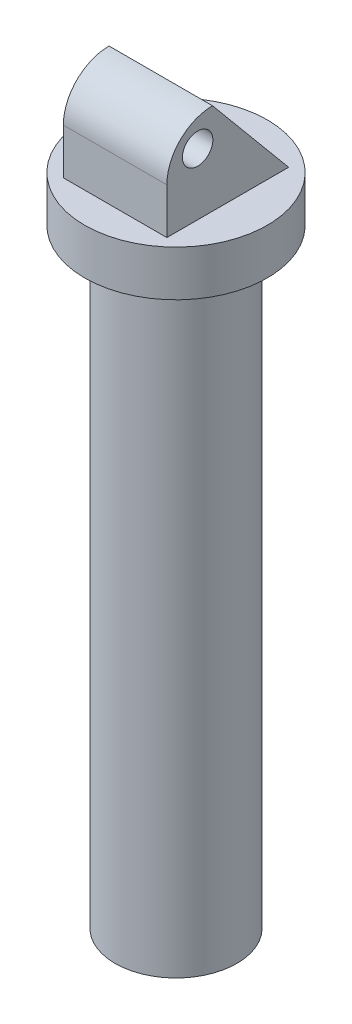
ISO-10303-21;
HEADER;
FILE_DESCRIPTION(('STEP AP214'),'2;1');
FILE_NAME('part.step','',(''),(''),'','','');
FILE_SCHEMA(('AUTOMOTIVE_DESIGN { 1 0 10303 214 1 1 1 1 }'));
ENDSEC;
DATA;
#1=APPLICATION_CONTEXT('core data for automotive mechanical design processes');
#2=APPLICATION_PROTOCOL_DEFINITION('international standard','automotive_design',2000,#1);
#3=PRODUCT_CONTEXT('',#1,'mechanical');
#4=PRODUCT('Part','Part','',(#3));
#5=PRODUCT_RELATED_PRODUCT_CATEGORY('part','',(#4));
#6=PRODUCT_DEFINITION_FORMATION('','',#4);
#7=PRODUCT_DEFINITION_CONTEXT('part definition',#1,'design');
#8=PRODUCT_DEFINITION('design','',#6,#7);
#9=PRODUCT_DEFINITION_SHAPE('','',#8);
#10=(LENGTH_UNIT() NAMED_UNIT(*) SI_UNIT(.MILLI.,.METRE.));
#11=(NAMED_UNIT(*) PLANE_ANGLE_UNIT() SI_UNIT($,.RADIAN.));
#12=(NAMED_UNIT(*) SI_UNIT($,.STERADIAN.) SOLID_ANGLE_UNIT());
#13=UNCERTAINTY_MEASURE_WITH_UNIT(LENGTH_MEASURE(1.E-05),#10,'distance_accuracy_value','');
#14=(GEOMETRIC_REPRESENTATION_CONTEXT(3) GLOBAL_UNCERTAINTY_ASSIGNED_CONTEXT((#13)) GLOBAL_UNIT_ASSIGNED_CONTEXT((#10,
#11,#12)) REPRESENTATION_CONTEXT('',''));
#15=CARTESIAN_POINT('',(0.,0.,0.));
#16=DIRECTION('',(0.,0.,1.));
#17=DIRECTION('',(1.,0.,0.));
#18=AXIS2_PLACEMENT_3D('',#15,#16,#17);
#19=CARTESIAN_POINT('',(0.,200.,0.));
#20=DIRECTION('',(0.,-1.,0.));
#21=DIRECTION('',(0.,0.,-1.));
#22=AXIS2_PLACEMENT_3D('',#19,#20,#21);
#23=CYLINDRICAL_SURFACE('',#22,20.);
#24=CARTESIAN_POINT('',(0.,200.,0.));
#25=DIRECTION('',(0.,1.,0.));
#26=DIRECTION('',(0.,0.,1.));
#27=AXIS2_PLACEMENT_3D('',#24,#25,#26);
#28=CIRCLE('',#27,20.);
#29=CARTESIAN_POINT('',(0.,200.,20.));
#30=VERTEX_POINT('',#29);
#31=EDGE_CURVE('E98',#30,#30,#28,.T.);
#32=ORIENTED_EDGE('',*,*,#31,.F.);
#33=EDGE_LOOP('',(#32));
#34=FACE_BOUND('',#33,.T.);
#35=CARTESIAN_POINT('',(0.,0.,0.));
#36=DIRECTION('',(0.,1.,0.));
#37=DIRECTION('',(0.,0.,1.));
#38=AXIS2_PLACEMENT_3D('',#35,#36,#37);
#39=CIRCLE('',#38,20.);
#40=CARTESIAN_POINT('',(0.,0.,20.));
#41=VERTEX_POINT('',#40);
#42=EDGE_CURVE('E137',#41,#41,#39,.T.);
#43=ORIENTED_EDGE('',*,*,#42,.T.);
#44=EDGE_LOOP('',(#43));
#45=FACE_BOUND('',#44,.T.);
#46=ADVANCED_FACE('F45',(#34,#45),#23,.T.);
#47=CARTESIAN_POINT('',(0.,0.,0.));
#48=DIRECTION('',(0.,1.,0.));
#49=DIRECTION('',(0.,0.,1.));
#50=AXIS2_PLACEMENT_3D('',#47,#48,#49);
#51=PLANE('',#50);
#52=ORIENTED_EDGE('',*,*,#42,.F.);
#53=EDGE_LOOP('',(#52));
#54=FACE_BOUND('',#53,.T.);
#55=ADVANCED_FACE('F151',(#54),#51,.F.);
#56=CARTESIAN_POINT('',(0.,215.,0.));
#57=DIRECTION('',(0.,-1.,0.));
#58=DIRECTION('',(0.,0.,-1.));
#59=AXIS2_PLACEMENT_3D('',#56,#57,#58);
#60=CYLINDRICAL_SURFACE('',#59,30.);
#61=CARTESIAN_POINT('',(0.,215.,0.));
#62=DIRECTION('',(0.,1.,0.));
#63=DIRECTION('',(0.,0.,1.));
#64=AXIS2_PLACEMENT_3D('',#61,#62,#63);
#65=CIRCLE('',#64,30.);
#66=CARTESIAN_POINT('',(0.,215.,30.));
#67=VERTEX_POINT('',#66);
#68=EDGE_CURVE('E133',#67,#67,#65,.T.);
#69=ORIENTED_EDGE('',*,*,#68,.F.);
#70=EDGE_LOOP('',(#69));
#71=FACE_BOUND('',#70,.T.);
#72=CARTESIAN_POINT('',(0.,200.,0.));
#73=DIRECTION('',(0.,1.,0.));
#74=DIRECTION('',(0.,0.,1.));
#75=AXIS2_PLACEMENT_3D('',#72,#73,#74);
#76=CIRCLE('',#75,30.);
#77=CARTESIAN_POINT('',(0.,200.,30.));
#78=VERTEX_POINT('',#77);
#79=EDGE_CURVE('E132',#78,#78,#76,.T.);
#80=ORIENTED_EDGE('',*,*,#79,.T.);
#81=EDGE_LOOP('',(#80));
#82=FACE_BOUND('',#81,.T.);
#83=ADVANCED_FACE('F153',(#71,#82),#60,.T.);
#84=CARTESIAN_POINT('',(0.,215.,0.));
#85=DIRECTION('',(0.,1.,0.));
#86=DIRECTION('',(0.,0.,1.));
#87=AXIS2_PLACEMENT_3D('',#84,#85,#86);
#88=PLANE('',#87);
#89=DIRECTION('',(0.,0.,1.));
#90=VECTOR('',#89,1.);
#91=CARTESIAN_POINT('',(-17.,215.,20.));
#92=LINE('',#91,#90);
#93=CARTESIAN_POINT('',(-17.,215.,-20.));
#94=VERTEX_POINT('',#93);
#95=CARTESIAN_POINT('',(-17.,215.,20.));
#96=VERTEX_POINT('',#95);
#97=EDGE_CURVE('E118',#94,#96,#92,.T.);
#98=ORIENTED_EDGE('',*,*,#97,.F.);
#99=DIRECTION('',(-1.,0.,0.));
#100=VECTOR('',#99,1.);
#101=CARTESIAN_POINT('',(-17.,215.,-20.));
#102=LINE('',#101,#100);
#103=CARTESIAN_POINT('',(17.,215.,-20.));
#104=VERTEX_POINT('',#103);
#105=EDGE_CURVE('E115',#104,#94,#102,.T.);
#106=ORIENTED_EDGE('',*,*,#105,.F.);
#107=DIRECTION('',(0.,0.,-1.));
#108=VECTOR('',#107,1.);
#109=CARTESIAN_POINT('',(17.,215.,20.));
#110=LINE('',#109,#108);
#111=CARTESIAN_POINT('',(17.,215.,20.));
#112=VERTEX_POINT('',#111);
#113=EDGE_CURVE('E103',#112,#104,#110,.T.);
#114=ORIENTED_EDGE('',*,*,#113,.F.);
#115=DIRECTION('',(1.,0.,0.));
#116=VECTOR('',#115,1.);
#117=CARTESIAN_POINT('',(-17.,215.,20.));
#118=LINE('',#117,#116);
#119=EDGE_CURVE('E122',#96,#112,#118,.T.);
#120=ORIENTED_EDGE('',*,*,#119,.F.);
#121=EDGE_LOOP('',(#98,#106,#114,#120));
#122=FACE_BOUND('',#121,.T.);
#123=ORIENTED_EDGE('',*,*,#68,.T.);
#124=EDGE_LOOP('',(#123));
#125=FACE_BOUND('',#124,.T.);
#126=ADVANCED_FACE('F160',(#122,#125),#88,.T.);
#127=CARTESIAN_POINT('',(0.,200.,0.));
#128=DIRECTION('',(0.,1.,0.));
#129=DIRECTION('',(0.,0.,1.));
#130=AXIS2_PLACEMENT_3D('',#127,#128,#129);
#131=PLANE('',#130);
#132=ORIENTED_EDGE('',*,*,#31,.T.);
#133=EDGE_LOOP('',(#132));
#134=FACE_BOUND('',#133,.T.);
#135=ORIENTED_EDGE('',*,*,#79,.F.);
#136=EDGE_LOOP('',(#135));
#137=FACE_BOUND('',#136,.T.);
#138=ADVANCED_FACE('F165',(#134,#137),#131,.F.);
#139=CARTESIAN_POINT('',(17.,245.,20.));
#140=DIRECTION('',(-1.,0.,0.));
#141=DIRECTION('',(0.,0.,1.));
#142=AXIS2_PLACEMENT_3D('',#139,#140,#141);
#143=PLANE('',#142);
#144=CARTESIAN_POINT('',(17.,235.24975043011,9.89187481826981));
#145=DIRECTION('',(1.,0.,0.));
#146=DIRECTION('',(0.,0.,-1.));
#147=AXIS2_PLACEMENT_3D('',#144,#145,#146);
#148=CIRCLE('',#147,5.);
#149=CARTESIAN_POINT('',(17.,235.24975043011,4.89187481826981));
#150=VERTEX_POINT('',#149);
#151=EDGE_CURVE('E110',#150,#150,#148,.T.);
#152=ORIENTED_EDGE('',*,*,#151,.F.);
#153=EDGE_LOOP('',(#152));
#154=FACE_BOUND('',#153,.T.);
#155=DIRECTION('',(0.,-0.768221279597376,-0.64018439966448));
#156=VECTOR('',#155,1.);
#157=CARTESIAN_POINT('',(17.,215.,-20.));
#158=LINE('',#157,#156);
#159=CARTESIAN_POINT('',(17.,245.,5.));
#160=VERTEX_POINT('',#159);
#161=EDGE_CURVE('E93',#160,#104,#158,.T.);
#162=ORIENTED_EDGE('',*,*,#161,.F.);
#163=CARTESIAN_POINT('',(17.,230.,5.));
#164=DIRECTION('',(-1.,0.,0.));
#165=DIRECTION('',(0.,0.,1.));
#166=AXIS2_PLACEMENT_3D('',#163,#164,#165);
#167=CIRCLE('',#166,15.);
#168=CARTESIAN_POINT('',(17.,230.,20.));
#169=VERTEX_POINT('',#168);
#170=EDGE_CURVE('E69',#160,#169,#167,.F.);
#171=ORIENTED_EDGE('',*,*,#170,.T.);
#172=DIRECTION('',(0.,-1.,0.));
#173=VECTOR('',#172,1.);
#174=CARTESIAN_POINT('',(17.,245.,20.));
#175=LINE('',#174,#173);
#176=EDGE_CURVE('E126',#169,#112,#175,.T.);
#177=ORIENTED_EDGE('',*,*,#176,.T.);
#178=ORIENTED_EDGE('',*,*,#113,.T.);
#179=EDGE_LOOP('',(#162,#171,#177,#178));
#180=FACE_BOUND('',#179,.T.);
#181=ADVANCED_FACE('F101',(#154,#180),#143,.F.);
#182=CARTESIAN_POINT('',(-17.,245.,20.));
#183=DIRECTION('',(1.,0.,0.));
#184=DIRECTION('',(0.,0.,-1.));
#185=AXIS2_PLACEMENT_3D('',#182,#183,#184);
#186=PLANE('',#185);
#187=CARTESIAN_POINT('',(-17.,235.24975043011,9.89187481826981));
#188=DIRECTION('',(1.,0.,0.));
#189=DIRECTION('',(0.,0.,-1.));
#190=AXIS2_PLACEMENT_3D('',#187,#188,#189);
#191=CIRCLE('',#190,5.);
#192=CARTESIAN_POINT('',(-17.,235.24975043011,4.89187481826981));
#193=VERTEX_POINT('',#192);
#194=EDGE_CURVE('E49',#193,#193,#191,.T.);
#195=ORIENTED_EDGE('',*,*,#194,.T.);
#196=EDGE_LOOP('',(#195));
#197=FACE_BOUND('',#196,.T.);
#198=DIRECTION('',(0.,-1.,0.));
#199=VECTOR('',#198,1.);
#200=CARTESIAN_POINT('',(-17.,245.,20.));
#201=LINE('',#200,#199);
#202=CARTESIAN_POINT('',(-17.,230.,20.));
#203=VERTEX_POINT('',#202);
#204=EDGE_CURVE('E129',#203,#96,#201,.T.);
#205=ORIENTED_EDGE('',*,*,#204,.F.);
#206=CARTESIAN_POINT('',(-17.,230.,5.));
#207=DIRECTION('',(1.,0.,0.));
#208=DIRECTION('',(0.,0.,-1.));
#209=AXIS2_PLACEMENT_3D('',#206,#207,#208);
#210=CIRCLE('',#209,15.);
#211=CARTESIAN_POINT('',(-17.,245.,5.));
#212=VERTEX_POINT('',#211);
#213=EDGE_CURVE('E11',#203,#212,#210,.F.);
#214=ORIENTED_EDGE('',*,*,#213,.T.);
#215=DIRECTION('',(0.,-0.768221279597376,-0.64018439966448));
#216=VECTOR('',#215,1.);
#217=CARTESIAN_POINT('',(-17.,252.377049180328,11.1475409836066));
#218=LINE('',#217,#216);
#219=EDGE_CURVE('E96',#212,#94,#218,.T.);
#220=ORIENTED_EDGE('',*,*,#219,.T.);
#221=ORIENTED_EDGE('',*,*,#97,.T.);
#222=EDGE_LOOP('',(#205,#214,#220,#221));
#223=FACE_BOUND('',#222,.T.);
#224=ADVANCED_FACE('F173',(#197,#223),#186,.F.);
#225=CARTESIAN_POINT('',(-17.,245.,20.));
#226=DIRECTION('',(0.,0.,-1.));
#227=DIRECTION('',(-1.,0.,0.));
#228=AXIS2_PLACEMENT_3D('',#225,#226,#227);
#229=PLANE('',#228);
#230=ORIENTED_EDGE('',*,*,#176,.F.);
#231=DIRECTION('',(1.,0.,0.));
#232=VECTOR('',#231,1.);
#233=CARTESIAN_POINT('',(-17.,230.,20.));
#234=LINE('',#233,#232);
#235=EDGE_CURVE('E55',#169,#203,#234,.F.);
#236=ORIENTED_EDGE('',*,*,#235,.T.);
#237=ORIENTED_EDGE('',*,*,#204,.T.);
#238=ORIENTED_EDGE('',*,*,#119,.T.);
#239=EDGE_LOOP('',(#230,#236,#237,#238));
#240=FACE_BOUND('',#239,.T.);
#241=ADVANCED_FACE('F177',(#240),#229,.F.);
#242=CARTESIAN_POINT('',(-42.,215.,-20.));
#243=DIRECTION('',(0.,-0.64018439966448,0.768221279597376));
#244=DIRECTION('',(0.,-0.768221279597376,-0.64018439966448));
#245=AXIS2_PLACEMENT_3D('',#242,#243,#244);
#246=PLANE('',#245);
#247=DIRECTION('',(-1.,0.,0.));
#248=VECTOR('',#247,1.);
#249=CARTESIAN_POINT('',(0.,245.,5.));
#250=LINE('',#249,#248);
#251=EDGE_CURVE('E87',#160,#212,#250,.T.);
#252=ORIENTED_EDGE('',*,*,#251,.F.);
#253=ORIENTED_EDGE('',*,*,#161,.T.);
#254=ORIENTED_EDGE('',*,*,#105,.T.);
#255=ORIENTED_EDGE('',*,*,#219,.F.);
#256=EDGE_LOOP('',(#252,#253,#254,#255));
#257=FACE_BOUND('',#256,.T.);
#258=ADVANCED_FACE('F92',(#257),#246,.F.);
#259=CARTESIAN_POINT('',(0.,230.,5.));
#260=DIRECTION('',(1.,0.,0.));
#261=DIRECTION('',(0.,0.,-1.));
#262=AXIS2_PLACEMENT_3D('',#259,#260,#261);
#263=CYLINDRICAL_SURFACE('',#262,15.);
#264=ORIENTED_EDGE('',*,*,#213,.F.);
#265=ORIENTED_EDGE('',*,*,#235,.F.);
#266=ORIENTED_EDGE('',*,*,#170,.F.);
#267=ORIENTED_EDGE('',*,*,#251,.T.);
#268=EDGE_LOOP('',(#264,#265,#266,#267));
#269=FACE_BOUND('',#268,.T.);
#270=ADVANCED_FACE('F47',(#269),#263,.T.);
#271=CARTESIAN_POINT('',(-42.,235.24975043011,9.89187481826981));
#272=DIRECTION('',(1.,0.,0.));
#273=DIRECTION('',(0.,0.,-1.));
#274=AXIS2_PLACEMENT_3D('',#271,#272,#273);
#275=CYLINDRICAL_SURFACE('',#274,5.);
#276=CARTESIAN_POINT('',(17.,235.24975043011,4.89187481826981));
#277=CARTESIAN_POINT('',(16.6458333333333,235.24975043011,4.89187481826981));
#278=CARTESIAN_POINT('',(16.2916666666667,235.24975043011,4.89187481826981));
#279=CARTESIAN_POINT('',(15.5833333333333,235.24975043011,4.89187481826981));
#280=CARTESIAN_POINT('',(15.2291666666667,235.24975043011,4.89187481826981));
#281=CARTESIAN_POINT('',(14.5208333333333,235.24975043011,4.89187481826981));
#282=CARTESIAN_POINT('',(14.1666666666667,235.24975043011,4.89187481826981));
#283=CARTESIAN_POINT('',(13.4583333333333,235.24975043011,4.89187481826981));
#284=CARTESIAN_POINT('',(13.1041666666667,235.24975043011,4.89187481826981));
#285=CARTESIAN_POINT('',(12.3958333333333,235.24975043011,4.89187481826981));
#286=CARTESIAN_POINT('',(12.0416666666667,235.24975043011,4.89187481826981));
#287=CARTESIAN_POINT('',(11.3333333333333,235.24975043011,4.89187481826981));
#288=CARTESIAN_POINT('',(10.9791666666667,235.24975043011,4.89187481826981));
#289=CARTESIAN_POINT('',(10.2708333333333,235.24975043011,4.89187481826981));
#290=CARTESIAN_POINT('',(9.91666666666666,235.24975043011,4.89187481826981));
#291=CARTESIAN_POINT('',(9.20833333333333,235.24975043011,4.89187481826981));
#292=CARTESIAN_POINT('',(8.85416666666666,235.24975043011,4.89187481826981));
#293=CARTESIAN_POINT('',(8.14583333333333,235.24975043011,4.89187481826981));
#294=CARTESIAN_POINT('',(7.79166666666666,235.24975043011,4.89187481826981));
#295=CARTESIAN_POINT('',(7.08333333333333,235.24975043011,4.89187481826981));
#296=CARTESIAN_POINT('',(6.72916666666666,235.24975043011,4.89187481826981));
#297=CARTESIAN_POINT('',(6.02083333333333,235.24975043011,4.89187481826981));
#298=CARTESIAN_POINT('',(5.66666666666666,235.24975043011,4.89187481826981));
#299=CARTESIAN_POINT('',(4.95833333333332,235.24975043011,4.89187481826981));
#300=CARTESIAN_POINT('',(4.60416666666666,235.24975043011,4.89187481826981));
#301=CARTESIAN_POINT('',(3.89583333333332,235.24975043011,4.89187481826981));
#302=CARTESIAN_POINT('',(3.54166666666666,235.24975043011,4.89187481826981));
#303=CARTESIAN_POINT('',(2.83333333333332,235.24975043011,4.89187481826981));
#304=CARTESIAN_POINT('',(2.47916666666665,235.24975043011,4.89187481826981));
#305=CARTESIAN_POINT('',(1.77083333333332,235.24975043011,4.89187481826981));
#306=CARTESIAN_POINT('',(1.41666666666665,235.24975043011,4.89187481826981));
#307=CARTESIAN_POINT('',(0.708333333333322,235.24975043011,4.89187481826981));
#308=CARTESIAN_POINT('',(0.354166666666658,235.24975043011,4.89187481826981));
#309=CARTESIAN_POINT('',(-0.354166666666676,235.24975043011,4.89187481826981));
#310=CARTESIAN_POINT('',(-0.708333333333345,235.24975043011,4.89187481826981));
#311=CARTESIAN_POINT('',(-1.41666666666668,235.24975043011,4.89187481826981));
#312=CARTESIAN_POINT('',(-1.77083333333334,235.24975043011,4.89187481826981));
#313=CARTESIAN_POINT('',(-2.47916666666668,235.24975043011,4.89187481826981));
#314=CARTESIAN_POINT('',(-2.83333333333334,235.24975043011,4.89187481826981));
#315=CARTESIAN_POINT('',(-3.54166666666668,235.24975043011,4.89187481826981));
#316=CARTESIAN_POINT('',(-3.89583333333334,235.24975043011,4.89187481826981));
#317=CARTESIAN_POINT('',(-4.60416666666668,235.24975043011,4.89187481826981));
#318=CARTESIAN_POINT('',(-4.95833333333334,235.24975043011,4.89187481826981));
#319=CARTESIAN_POINT('',(-5.66666666666668,235.24975043011,4.89187481826981));
#320=CARTESIAN_POINT('',(-6.02083333333335,235.24975043011,4.89187481826981));
#321=CARTESIAN_POINT('',(-6.72916666666668,235.24975043011,4.89187481826981));
#322=CARTESIAN_POINT('',(-7.08333333333335,235.24975043011,4.89187481826981));
#323=CARTESIAN_POINT('',(-7.79166666666668,235.24975043011,4.89187481826981));
#324=CARTESIAN_POINT('',(-8.14583333333335,235.24975043011,4.89187481826981));
#325=CARTESIAN_POINT('',(-8.85416666666668,235.24975043011,4.89187481826981));
#326=CARTESIAN_POINT('',(-9.20833333333334,235.24975043011,4.89187481826981));
#327=CARTESIAN_POINT('',(-9.91666666666668,235.24975043011,4.89187481826981));
#328=CARTESIAN_POINT('',(-10.2708333333333,235.24975043011,4.89187481826981));
#329=CARTESIAN_POINT('',(-10.9791666666667,235.24975043011,4.89187481826981));
#330=CARTESIAN_POINT('',(-11.3333333333333,235.24975043011,4.89187481826981));
#331=CARTESIAN_POINT('',(-12.0416666666667,235.24975043011,4.89187481826981));
#332=CARTESIAN_POINT('',(-12.3958333333333,235.24975043011,4.89187481826981));
#333=CARTESIAN_POINT('',(-13.1041666666667,235.24975043011,4.89187481826981));
#334=CARTESIAN_POINT('',(-13.4583333333333,235.24975043011,4.89187481826981));
#335=CARTESIAN_POINT('',(-14.1666666666667,235.24975043011,4.89187481826981));
#336=CARTESIAN_POINT('',(-14.5208333333333,235.24975043011,4.89187481826981));
#337=CARTESIAN_POINT('',(-15.2291666666667,235.24975043011,4.89187481826981));
#338=CARTESIAN_POINT('',(-15.5833333333333,235.24975043011,4.89187481826981));
#339=CARTESIAN_POINT('',(-16.2916666666667,235.24975043011,4.89187481826981));
#340=CARTESIAN_POINT('',(-16.6458333333333,235.24975043011,4.89187481826981));
#341=CARTESIAN_POINT('',(-17.,235.24975043011,4.89187481826981));
#342=B_SPLINE_CURVE_WITH_KNOTS('',3,(#276,#277,#278,#279,#280,#281,#282,#283,#284,#285,#286,
#287,#288,#289,#290,#291,#292,#293,#294,#295,#296,#297,#298,#299,#300,#301,#302,#303,#304,#305,
#306,#307,#308,#309,#310,#311,#312,#313,#314,#315,#316,#317,#318,#319,#320,#321,#322,#323,#324,
#325,#326,#327,#328,#329,#330,#331,#332,#333,#334,#335,#336,#337,#338,#339,#340,#341),
.UNSPECIFIED.,.F.,.F.,(4,2,2,2,2,2,2,2,2,2,2,2,2,2,2,2,2,2,2,2,2,2,2,2,2,2,2,2,2,2,2,2,4),(0.,
1.0625,2.125,3.1875,4.25,5.3125,6.37500000000001,7.4375,8.5,9.5625,10.625,11.6875,12.75,13.8125,
14.875,15.9375,17.,18.0625,19.125,20.1875,21.25,22.3125,23.375,24.4375,25.5,26.5625,27.625,
28.6875,29.75,30.8125,31.875,32.9375,34.),.UNSPECIFIED.);
#343=EDGE_CURVE('BSEAM183',#150,#193,#342,.T.);
#344=ORIENTED_EDGE('',*,*,#151,.T.);
#345=ORIENTED_EDGE('',*,*,#194,.F.);
#346=ORIENTED_EDGE('',*,*,#343,.T.);
#347=ORIENTED_EDGE('',*,*,#343,.F.);
#348=EDGE_LOOP('',(#344,#346,#345,#347));
#349=FACE_BOUND('',#348,.T.);
#350=ADVANCED_FACE('F183',(#349),#275,.F.);
#351=CLOSED_SHELL('',(#46,#55,#83,#126,#138,#181,#224,#241,#258,#270,#350));
#352=MANIFOLD_SOLID_BREP('B2',#351);
#353=ADVANCED_BREP_SHAPE_REPRESENTATION('',(#18,#352),#14);
#354=SHAPE_DEFINITION_REPRESENTATION(#9,#353);
ENDSEC;
END-ISO-10303-21;
